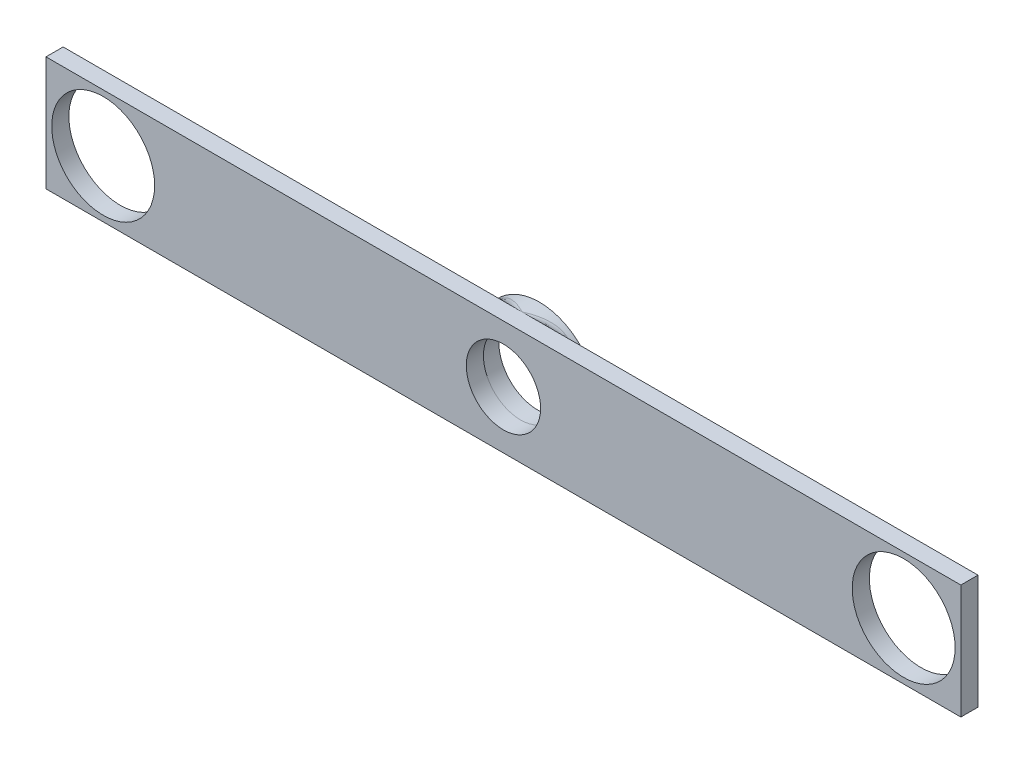
ISO-10303-21;
HEADER;
FILE_DESCRIPTION(('STEP AP214'),'2;1');
FILE_NAME('part.step','',(''),(''),'','','');
FILE_SCHEMA(('AUTOMOTIVE_DESIGN { 1 0 10303 214 1 1 1 1 }'));
ENDSEC;
DATA;
#1=APPLICATION_CONTEXT('core data for automotive mechanical design processes');
#2=APPLICATION_PROTOCOL_DEFINITION('international standard','automotive_design',2000,#1);
#3=PRODUCT_CONTEXT('',#1,'mechanical');
#4=PRODUCT('Part','Part','',(#3));
#5=PRODUCT_RELATED_PRODUCT_CATEGORY('part','',(#4));
#6=PRODUCT_DEFINITION_FORMATION('','',#4);
#7=PRODUCT_DEFINITION_CONTEXT('part definition',#1,'design');
#8=PRODUCT_DEFINITION('design','',#6,#7);
#9=PRODUCT_DEFINITION_SHAPE('','',#8);
#10=(LENGTH_UNIT() NAMED_UNIT(*) SI_UNIT(.MILLI.,.METRE.));
#11=(NAMED_UNIT(*) PLANE_ANGLE_UNIT() SI_UNIT($,.RADIAN.));
#12=(NAMED_UNIT(*) SI_UNIT($,.STERADIAN.) SOLID_ANGLE_UNIT());
#13=UNCERTAINTY_MEASURE_WITH_UNIT(LENGTH_MEASURE(1.E-05),#10,'distance_accuracy_value','');
#14=(GEOMETRIC_REPRESENTATION_CONTEXT(3) GLOBAL_UNCERTAINTY_ASSIGNED_CONTEXT((#13)) GLOBAL_UNIT_ASSIGNED_CONTEXT((#10,
#11,#12)) REPRESENTATION_CONTEXT('',''));
#15=CARTESIAN_POINT('',(0.,0.,0.));
#16=DIRECTION('',(0.,0.,1.));
#17=DIRECTION('',(1.,0.,0.));
#18=AXIS2_PLACEMENT_3D('',#15,#16,#17);
#19=CARTESIAN_POINT('',(0.,0.,34.4107464630014));
#20=DIRECTION('',(0.,0.,1.));
#21=DIRECTION('',(1.,0.,0.));
#22=AXIS2_PLACEMENT_3D('',#19,#20,#21);
#23=PLANE('',#22);
#24=DIRECTION('',(1.,0.,0.));
#25=VECTOR('',#24,1.);
#26=CARTESIAN_POINT('',(-28.6015516653559,2.37763021879761,34.4107464630014));
#27=LINE('',#26,#25);
#28=CARTESIAN_POINT('',(-120.980670706278,2.3776302187976,34.4107464630014));
#29=VERTEX_POINT('',#28);
#30=CARTESIAN_POINT('',(-28.6015516653559,2.37763021879761,34.4107464630014));
#31=VERTEX_POINT('',#30);
#32=EDGE_CURVE('E293',#29,#31,#27,.T.);
#33=ORIENTED_EDGE('',*,*,#32,.F.);
#34=CARTESIAN_POINT('',(-129.831228986063,14.9458338361228,34.4107464630014));
#35=DIRECTION('',(0.,0.,1.));
#36=DIRECTION('',(1.,0.,0.));
#37=AXIS2_PLACEMENT_3D('',#34,#35,#36);
#38=CIRCLE('',#37,15.3717963826748);
#39=CARTESIAN_POINT('',(-121.367357199228,27.7776302187976,34.4107464630014));
#40=VERTEX_POINT('',#39);
#41=EDGE_CURVE('E363',#29,#40,#38,.T.);
#42=ORIENTED_EDGE('',*,*,#41,.T.);
#43=DIRECTION('',(-1.,0.,0.));
#44=VECTOR('',#43,1.);
#45=CARTESIAN_POINT('',(-28.6015516653559,27.7776302187976,34.4107464630014));
#46=LINE('',#45,#44);
#47=CARTESIAN_POINT('',(-28.6015516653559,27.7776302187976,34.4107464630014));
#48=VERTEX_POINT('',#47);
#49=EDGE_CURVE('E124',#48,#40,#46,.T.);
#50=ORIENTED_EDGE('',*,*,#49,.F.);
#51=DIRECTION('',(0.,1.,0.));
#52=VECTOR('',#51,1.);
#53=CARTESIAN_POINT('',(-28.6015516653559,2.37763021879761,34.4107464630014));
#54=LINE('',#53,#52);
#55=EDGE_CURVE('E275',#31,#48,#54,.T.);
#56=ORIENTED_EDGE('',*,*,#55,.F.);
#57=EDGE_LOOP('',(#33,#42,#50,#56));
#58=FACE_BOUND('',#57,.T.);
#59=CARTESIAN_POINT('',(-41.3015516653559,15.0776302187978,34.4107464630014));
#60=DIRECTION('',(0.,0.,1.));
#61=DIRECTION('',(1.,0.,0.));
#62=AXIS2_PLACEMENT_3D('',#59,#60,#61);
#63=CIRCLE('',#62,11.43);
#64=CARTESIAN_POINT('',(-29.8715516653559,15.0776302187978,34.4107464630014));
#65=VERTEX_POINT('',#64);
#66=EDGE_CURVE('E259',#65,#65,#63,.T.);
#67=ORIENTED_EDGE('',*,*,#66,.T.);
#68=EDGE_LOOP('',(#67));
#69=FACE_BOUND('',#68,.T.);
#70=ADVANCED_FACE('F34',(#58,#69),#23,.F.);
#71=CARTESIAN_POINT('',(-130.201551665356,15.0776302187976,34.4107464630014));
#72=DIRECTION('',(0.,0.,1.));
#73=DIRECTION('',(1.,0.,0.));
#74=AXIS2_PLACEMENT_3D('',#71,#72,#73);
#75=CIRCLE('',#74,8.255);
#76=CARTESIAN_POINT('',(-130.201551665356,6.82263021879756,34.4107464630014));
#77=VERTEX_POINT('',#76);
#78=EDGE_CURVE('E269',#77,#77,#75,.T.);
#79=ORIENTED_EDGE('',*,*,#78,.T.);
#80=CARTESIAN_POINT('',(-130.201551665356,15.4509186698988,34.4107464630014));
#81=DIRECTION('',(0.,0.,-1.));
#82=DIRECTION('',(-1.,0.,0.));
#83=AXIS2_PLACEMENT_3D('',#80,#81,#82);
#84=CIRCLE('',#83,8.62828845110121);
#85=EDGE_CURVE('E211',#77,#77,#84,.T.);
#86=ORIENTED_EDGE('',*,*,#85,.T.);
#87=EDGE_LOOP('',(#79,#86));
#88=FACE_BOUND('',#87,.T.);
#89=ADVANCED_FACE('F233',(#88),#23,.F.);
#90=CARTESIAN_POINT('',(0.,0.,38.2207464630014));
#91=DIRECTION('',(0.,0.,1.));
#92=DIRECTION('',(1.,0.,0.));
#93=AXIS2_PLACEMENT_3D('',#90,#91,#92);
#94=PLANE('',#93);
#95=CARTESIAN_POINT('',(-41.3015516653559,15.0776302187978,38.2207464630014));
#96=DIRECTION('',(0.,0.,1.));
#97=DIRECTION('',(1.,0.,0.));
#98=AXIS2_PLACEMENT_3D('',#95,#96,#97);
#99=CIRCLE('',#98,11.43);
#100=CARTESIAN_POINT('',(-29.8715516653559,15.0776302187978,38.2207464630014));
#101=VERTEX_POINT('',#100);
#102=EDGE_CURVE('E266',#101,#101,#99,.T.);
#103=ORIENTED_EDGE('',*,*,#102,.F.);
#104=EDGE_LOOP('',(#103));
#105=FACE_BOUND('',#104,.T.);
#106=DIRECTION('',(0.,1.,0.));
#107=VECTOR('',#106,1.);
#108=CARTESIAN_POINT('',(-28.6015516653559,2.37763021879761,38.2207464630014));
#109=LINE('',#108,#107);
#110=CARTESIAN_POINT('',(-28.6015516653559,2.37763021879761,38.2207464630014));
#111=VERTEX_POINT('',#110);
#112=CARTESIAN_POINT('',(-28.6015516653559,27.7776302187976,38.2207464630014));
#113=VERTEX_POINT('',#112);
#114=EDGE_CURVE('E278',#111,#113,#109,.T.);
#115=ORIENTED_EDGE('',*,*,#114,.T.);
#116=DIRECTION('',(-1.,0.,0.));
#117=VECTOR('',#116,1.);
#118=CARTESIAN_POINT('',(-28.6015516653559,27.7776302187976,38.2207464630014));
#119=LINE('',#118,#117);
#120=CARTESIAN_POINT('',(-231.801551665356,27.7776302187976,38.2207464630014));
#121=VERTEX_POINT('',#120);
#122=EDGE_CURVE('E281',#113,#121,#119,.T.);
#123=ORIENTED_EDGE('',*,*,#122,.T.);
#124=DIRECTION('',(0.,-1.,0.));
#125=VECTOR('',#124,1.);
#126=CARTESIAN_POINT('',(-231.801551665356,2.37763021879758,38.2207464630014));
#127=LINE('',#126,#125);
#128=CARTESIAN_POINT('',(-231.801551665356,2.37763021879758,38.2207464630014));
#129=VERTEX_POINT('',#128);
#130=EDGE_CURVE('E284',#121,#129,#127,.T.);
#131=ORIENTED_EDGE('',*,*,#130,.T.);
#132=DIRECTION('',(1.,0.,0.));
#133=VECTOR('',#132,1.);
#134=CARTESIAN_POINT('',(-28.6015516653559,2.37763021879761,38.2207464630014));
#135=LINE('',#134,#133);
#136=EDGE_CURVE('E286',#129,#111,#135,.T.);
#137=ORIENTED_EDGE('',*,*,#136,.T.);
#138=EDGE_LOOP('',(#115,#123,#131,#137));
#139=FACE_BOUND('',#138,.T.);
#140=CARTESIAN_POINT('',(-130.201551665356,15.0776302187976,38.2207464630014));
#141=DIRECTION('',(0.,0.,1.));
#142=DIRECTION('',(1.,0.,0.));
#143=AXIS2_PLACEMENT_3D('',#140,#141,#142);
#144=CIRCLE('',#143,8.255);
#145=CARTESIAN_POINT('',(-121.946551665356,15.0776302187976,38.2207464630014));
#146=VERTEX_POINT('',#145);
#147=EDGE_CURVE('E272',#146,#146,#144,.T.);
#148=ORIENTED_EDGE('',*,*,#147,.F.);
#149=EDGE_LOOP('',(#148));
#150=FACE_BOUND('',#149,.T.);
#151=CARTESIAN_POINT('',(-219.101551665356,15.0776302187973,38.2207464630014));
#152=DIRECTION('',(0.,0.,1.));
#153=DIRECTION('',(1.,0.,0.));
#154=AXIS2_PLACEMENT_3D('',#151,#152,#153);
#155=CIRCLE('',#154,11.43);
#156=CARTESIAN_POINT('',(-207.671551665356,15.0776302187973,38.2207464630014));
#157=VERTEX_POINT('',#156);
#158=EDGE_CURVE('E255',#157,#157,#155,.T.);
#159=ORIENTED_EDGE('',*,*,#158,.F.);
#160=EDGE_LOOP('',(#159));
#161=FACE_BOUND('',#160,.T.);
#162=ADVANCED_FACE('F238',(#105,#139,#150,#161),#94,.T.);
#163=CARTESIAN_POINT('',(-138.295100772899,27.7776302187976,34.4107464630014));
#164=VERTEX_POINT('',#163);
#165=CARTESIAN_POINT('',(-231.801551665356,27.7776302187976,34.4107464630014));
#166=VERTEX_POINT('',#165);
#167=EDGE_CURVE('E129',#164,#166,#46,.T.);
#168=ORIENTED_EDGE('',*,*,#167,.F.);
#169=CARTESIAN_POINT('',(-129.831228986063,14.9458338361228,34.4107464630014));
#170=DIRECTION('',(0.,0.,1.));
#171=DIRECTION('',(1.,0.,0.));
#172=AXIS2_PLACEMENT_3D('',#169,#170,#171);
#173=CIRCLE('',#172,15.3717963826748);
#174=CARTESIAN_POINT('',(-138.681787265848,2.37763021879759,34.4107464630014));
#175=VERTEX_POINT('',#174);
#176=EDGE_CURVE('E365',#164,#175,#173,.T.);
#177=ORIENTED_EDGE('',*,*,#176,.T.);
#178=CARTESIAN_POINT('',(-231.801551665356,2.37763021879758,34.4107464630014));
#179=VERTEX_POINT('',#178);
#180=EDGE_CURVE('E282',#179,#175,#27,.T.);
#181=ORIENTED_EDGE('',*,*,#180,.F.);
#182=DIRECTION('',(0.,-1.,0.));
#183=VECTOR('',#182,1.);
#184=CARTESIAN_POINT('',(-231.801551665356,2.37763021879758,34.4107464630014));
#185=LINE('',#184,#183);
#186=EDGE_CURVE('E291',#166,#179,#185,.T.);
#187=ORIENTED_EDGE('',*,*,#186,.F.);
#188=EDGE_LOOP('',(#168,#177,#181,#187));
#189=FACE_BOUND('',#188,.T.);
#190=CARTESIAN_POINT('',(-219.101551665356,15.0776302187973,34.4107464630014));
#191=DIRECTION('',(0.,0.,1.));
#192=DIRECTION('',(1.,0.,0.));
#193=AXIS2_PLACEMENT_3D('',#190,#191,#192);
#194=CIRCLE('',#193,11.43);
#195=CARTESIAN_POINT('',(-207.671551665356,15.0776302187973,34.4107464630014));
#196=VERTEX_POINT('',#195);
#197=EDGE_CURVE('E253',#196,#196,#194,.T.);
#198=ORIENTED_EDGE('',*,*,#197,.T.);
#199=EDGE_LOOP('',(#198));
#200=FACE_BOUND('',#199,.T.);
#201=ADVANCED_FACE('F194',(#189,#200),#23,.F.);
#202=CARTESIAN_POINT('',(-28.6015516653559,2.37763021879761,38.2207464630014));
#203=DIRECTION('',(-1.,0.,0.));
#204=DIRECTION('',(0.,0.,1.));
#205=AXIS2_PLACEMENT_3D('',#202,#203,#204);
#206=PLANE('',#205);
#207=ORIENTED_EDGE('',*,*,#55,.T.);
#208=DIRECTION('',(0.,0.,-1.));
#209=VECTOR('',#208,1.);
#210=CARTESIAN_POINT('',(-28.6015516653559,27.7776302187976,38.2207464630014));
#211=LINE('',#210,#209);
#212=EDGE_CURVE('E305',#113,#48,#211,.T.);
#213=ORIENTED_EDGE('',*,*,#212,.F.);
#214=ORIENTED_EDGE('',*,*,#114,.F.);
#215=DIRECTION('',(0.,0.,-1.));
#216=VECTOR('',#215,1.);
#217=CARTESIAN_POINT('',(-28.6015516653559,2.37763021879761,38.2207464630014));
#218=LINE('',#217,#216);
#219=EDGE_CURVE('E288',#111,#31,#218,.T.);
#220=ORIENTED_EDGE('',*,*,#219,.T.);
#221=EDGE_LOOP('',(#207,#213,#214,#220));
#222=FACE_BOUND('',#221,.T.);
#223=ADVANCED_FACE('F231',(#222),#206,.F.);
#224=CARTESIAN_POINT('',(-28.6015516653559,27.7776302187976,38.2207464630014));
#225=DIRECTION('',(0.,-1.,0.));
#226=DIRECTION('',(1.,0.,0.));
#227=AXIS2_PLACEMENT_3D('',#224,#225,#226);
#228=PLANE('',#227);
#229=ORIENTED_EDGE('',*,*,#49,.T.);
#230=CARTESIAN_POINT('',(-129.831228986063,27.7776302187976,34.4107464630014));
#231=VERTEX_POINT('',#230);
#232=EDGE_CURVE('E117',#40,#231,#46,.T.);
#233=ORIENTED_EDGE('',*,*,#232,.T.);
#234=EDGE_CURVE('E121',#231,#164,#46,.T.);
#235=ORIENTED_EDGE('',*,*,#234,.T.);
#236=ORIENTED_EDGE('',*,*,#167,.T.);
#237=DIRECTION('',(0.,0.,-1.));
#238=VECTOR('',#237,1.);
#239=CARTESIAN_POINT('',(-231.801551665356,27.7776302187976,38.2207464630014));
#240=LINE('',#239,#238);
#241=EDGE_CURVE('E302',#121,#166,#240,.T.);
#242=ORIENTED_EDGE('',*,*,#241,.F.);
#243=ORIENTED_EDGE('',*,*,#122,.F.);
#244=ORIENTED_EDGE('',*,*,#212,.T.);
#245=EDGE_LOOP('',(#229,#233,#235,#236,#242,#243,#244));
#246=FACE_BOUND('',#245,.T.);
#247=ADVANCED_FACE('F119',(#246),#228,.F.);
#248=CARTESIAN_POINT('',(-231.801551665356,2.37763021879758,38.2207464630014));
#249=DIRECTION('',(1.,0.,0.));
#250=DIRECTION('',(0.,0.,-1.));
#251=AXIS2_PLACEMENT_3D('',#248,#249,#250);
#252=PLANE('',#251);
#253=ORIENTED_EDGE('',*,*,#186,.T.);
#254=DIRECTION('',(0.,0.,-1.));
#255=VECTOR('',#254,1.);
#256=CARTESIAN_POINT('',(-231.801551665356,2.37763021879758,38.2207464630014));
#257=LINE('',#256,#255);
#258=EDGE_CURVE('E299',#129,#179,#257,.T.);
#259=ORIENTED_EDGE('',*,*,#258,.F.);
#260=ORIENTED_EDGE('',*,*,#130,.F.);
#261=ORIENTED_EDGE('',*,*,#241,.T.);
#262=EDGE_LOOP('',(#253,#259,#260,#261));
#263=FACE_BOUND('',#262,.T.);
#264=ADVANCED_FACE('F224',(#263),#252,.F.);
#265=CARTESIAN_POINT('',(-28.6015516653559,2.37763021879761,38.2207464630014));
#266=DIRECTION('',(0.,1.,0.));
#267=DIRECTION('',(-1.,0.,0.));
#268=AXIS2_PLACEMENT_3D('',#265,#266,#267);
#269=PLANE('',#268);
#270=ORIENTED_EDGE('',*,*,#180,.T.);
#271=CARTESIAN_POINT('',(-138.681787265848,2.37763021879759,34.4107464630014));
#272=CARTESIAN_POINT('',(-138.543996931785,2.37763021879759,34.4107322033788));
#273=CARTESIAN_POINT('',(-138.406239600689,2.37763021879759,34.4070301402904));
#274=CARTESIAN_POINT('',(-138.131129446394,2.37763021879759,34.3928442007863));
#275=CARTESIAN_POINT('',(-137.993776474281,2.37763021879759,34.3823632518594));
#276=CARTESIAN_POINT('',(-137.719896684314,2.37763021879759,34.3552323668637));
#277=CARTESIAN_POINT('',(-137.583368945417,2.37763021879759,34.3385915719233));
#278=CARTESIAN_POINT('',(-137.311120305938,2.37763021879759,34.299629332474));
#279=CARTESIAN_POINT('',(-137.175399501786,2.37763021879759,34.2773072224621));
#280=CARTESIAN_POINT('',(-136.771121039036,2.37763021879759,34.2027459116105));
#281=CARTESIAN_POINT('',(-136.503971891012,2.37763021879759,34.1427558750772));
#282=CARTESIAN_POINT('',(-135.974388871651,2.37763021879759,34.0047134821015));
#283=CARTESIAN_POINT('',(-135.711955804096,2.37763021879759,33.9266580775799));
#284=CARTESIAN_POINT('',(-135.355634276484,2.37763021879759,33.8081867340615));
#285=CARTESIAN_POINT('',(-135.259333977653,2.37763021879759,33.7748925509306));
#286=CARTESIAN_POINT('',(-135.067575064461,2.37763021879759,33.7060245743292));
#287=CARTESIAN_POINT('',(-134.972116274612,2.37763021879759,33.6704512695812));
#288=CARTESIAN_POINT('',(-134.686958412802,2.37763021879759,33.5602738613162));
#289=CARTESIAN_POINT('',(-134.498562741522,2.37763021879759,33.4822404678469));
#290=CARTESIAN_POINT('',(-134.18241437799,2.37763021879759,33.3413143474447));
#291=CARTESIAN_POINT('',(-134.053523897699,2.37763021879759,33.2809624563867));
#292=CARTESIAN_POINT('',(-133.798604681793,2.37763021879759,33.1547457594638));
#293=CARTESIAN_POINT('',(-133.672573105429,2.37763021879759,33.0888867608784));
#294=CARTESIAN_POINT('',(-133.463143940271,2.37763021879759,32.9717405235663));
#295=CARTESIAN_POINT('',(-133.3787106067,2.37763021879759,32.9223161368228));
#296=CARTESIAN_POINT('',(-133.212286643156,2.37763021879759,32.819061588625));
#297=CARTESIAN_POINT('',(-133.130302435162,2.37763021879759,32.7652210310355));
#298=CARTESIAN_POINT('',(-132.968030739854,2.37763021879759,32.6500224068217));
#299=CARTESIAN_POINT('',(-132.887860950114,2.37763021879759,32.5884919235355));
#300=CARTESIAN_POINT('',(-132.773787253067,2.37763021879759,32.4892623219637));
#301=CARTESIAN_POINT('',(-132.736842384652,2.37763021879759,32.4550851608352));
#302=CARTESIAN_POINT('',(-132.665962268227,2.37763021879759,32.383769263175));
#303=CARTESIAN_POINT('',(-132.63202282467,2.37763021879759,32.3466347971851));
#304=CARTESIAN_POINT('',(-132.575094574326,2.37763021879759,32.2764733640809));
#305=CARTESIAN_POINT('',(-132.551277511822,2.37763021879759,32.2441275919245));
#306=CARTESIAN_POINT('',(-132.507908365654,2.37763021879759,32.1766457526617));
#307=CARTESIAN_POINT('',(-132.488352124951,2.37763021879759,32.1415124512666));
#308=CARTESIAN_POINT('',(-132.458669071917,2.37763021879759,32.0756038057517));
#309=CARTESIAN_POINT('',(-132.447443710425,2.37763021879759,32.0453329372127));
#310=CARTESIAN_POINT('',(-132.430200768428,2.37763021879759,31.9833761609145));
#311=CARTESIAN_POINT('',(-132.424166858371,2.37763021879759,31.9516950222787));
#312=CARTESIAN_POINT('',(-132.419524004395,2.37763021879759,31.9034645395491));
#313=CARTESIAN_POINT('',(-132.41872565161,2.37763021879759,31.8871063867348));
#314=CARTESIAN_POINT('',(-132.418748307707,2.37763021879759,31.8707464630013));
#315=B_SPLINE_CURVE_WITH_KNOTS('',3,(#271,#272,#273,#274,#275,#276,#277,#278,#279,#280,#281,
#282,#283,#284,#285,#286,#287,#288,#289,#290,#291,#292,#293,#294,#295,#296,#297,#298,#299,#300,
#301,#302,#303,#304,#305,#306,#307,#308,#309,#310,#311,#312,#313,#314),.UNSPECIFIED.,.F.,.F.,(4,
2,2,2,2,2,2,2,2,2,2,2,2,2,2,2,2,2,2,2,2,4),(0.,0.413273855018525,0.826369355128221,
1.23885426877134,1.65138752270578,2.47201588601664,3.29278281090843,3.59844070808591,
3.90403327960229,4.51548653313657,4.94235050329303,5.36876988602266,5.66217435571689,
5.95629052688636,6.25891525879904,6.40978701529864,6.56044472184935,6.68072946080365,
6.80089631408145,6.89739657163872,6.99359216914598,7.04265718750415),.UNSPECIFIED.);
#316=CARTESIAN_POINT('',(-132.418748307707,2.37763021879759,31.8707464630014));
#317=VERTEX_POINT('',#316);
#318=EDGE_CURVE('E48',#175,#317,#315,.T.);
#319=ORIENTED_EDGE('',*,*,#318,.T.);
#320=DIRECTION('',(0.,0.,1.));
#321=VECTOR('',#320,1.);
#322=CARTESIAN_POINT('',(-132.418748307707,2.37763021879759,34.4107464630014));
#323=LINE('',#322,#321);
#324=CARTESIAN_POINT('',(-132.418748307707,2.37763021879759,34.4107464630014));
#325=VERTEX_POINT('',#324);
#326=EDGE_CURVE('E56',#325,#317,#323,.F.);
#327=ORIENTED_EDGE('',*,*,#326,.F.);
#328=CARTESIAN_POINT('',(-127.243709664419,2.3776302187976,34.4107464630014));
#329=VERTEX_POINT('',#328);
#330=EDGE_CURVE('E296',#325,#329,#27,.T.);
#331=ORIENTED_EDGE('',*,*,#330,.T.);
#332=DIRECTION('',(0.,0.,1.));
#333=VECTOR('',#332,1.);
#334=CARTESIAN_POINT('',(-127.243709664419,2.3776302187976,31.8707464630014));
#335=LINE('',#334,#333);
#336=CARTESIAN_POINT('',(-127.243709664419,2.3776302187976,31.8707464630014));
#337=VERTEX_POINT('',#336);
#338=EDGE_CURVE('E150',#337,#329,#335,.T.);
#339=ORIENTED_EDGE('',*,*,#338,.F.);
#340=CARTESIAN_POINT('',(-127.243709664419,2.3776302187976,31.8707464630014));
#341=CARTESIAN_POINT('',(-127.243820286488,2.3776302187976,31.9033764329404));
#342=CARTESIAN_POINT('',(-127.240595001526,2.3776302187976,31.9358425107738));
#343=CARTESIAN_POINT('',(-127.228562260305,2.3776302187976,31.9992103010193));
#344=CARTESIAN_POINT('',(-127.219844823851,2.3776302187976,32.0301287208004));
#345=CARTESIAN_POINT('',(-127.193755702379,2.3776302187976,32.1014671066879));
#346=CARTESIAN_POINT('',(-127.174368763003,2.3776302187976,32.141129072768));
#347=CARTESIAN_POINT('',(-127.129731489622,2.3776302187976,32.2172390133331));
#348=CARTESIAN_POINT('',(-127.104437784065,2.3776302187976,32.2536603188912));
#349=CARTESIAN_POINT('',(-127.042411960045,2.3776302187976,32.3332801389004));
#350=CARTESIAN_POINT('',(-127.00446189084,2.3776302187976,32.3755119950818));
#351=CARTESIAN_POINT('',(-126.924709976941,2.3776302187976,32.4562171707469));
#352=CARTESIAN_POINT('',(-126.882900381734,2.3776302187976,32.494682593008));
#353=CARTESIAN_POINT('',(-126.796557820772,2.3776302187976,32.5688642599442));
#354=CARTESIAN_POINT('',(-126.752011846849,2.3776302187976,32.6045652001931));
#355=CARTESIAN_POINT('',(-126.661203723997,2.3776302187976,32.6735932544345));
#356=CARTESIAN_POINT('',(-126.614943249148,2.3776302187976,32.7069225958384));
#357=CARTESIAN_POINT('',(-126.479791357578,2.3776302187976,32.8002768601763));
#358=CARTESIAN_POINT('',(-126.389268928905,2.3776302187976,32.8579341327764));
#359=CARTESIAN_POINT('',(-126.205359064055,2.3776302187976,32.9685186518886));
#360=CARTESIAN_POINT('',(-126.11196988754,2.3776302187976,33.0214429456618));
#361=CARTESIAN_POINT('',(-125.92298194442,2.3776302187976,33.1236248720524));
#362=CARTESIAN_POINT('',(-125.827379282929,2.3776302187976,33.1728752763908));
#363=CARTESIAN_POINT('',(-125.634591413671,2.3776302187976,33.2681849965448));
#364=CARTESIAN_POINT('',(-125.53740599132,2.3776302187976,33.3142438751447));
#365=CARTESIAN_POINT('',(-125.243848812909,2.3776302187976,33.4482055825862));
#366=CARTESIAN_POINT('',(-125.045529644113,2.3776302187976,33.5318652282507));
#367=CARTESIAN_POINT('',(-124.645120166976,2.3776302187976,33.6889170845979));
#368=CARTESIAN_POINT('',(-124.443033580135,2.3776302187976,33.7623188761475));
#369=CARTESIAN_POINT('',(-123.975118986061,2.3776302187976,33.9191379777933));
#370=CARTESIAN_POINT('',(-123.708120921602,2.3776302187976,33.9990938651526));
#371=CARTESIAN_POINT('',(-123.169165429789,2.3776302187976,34.140342765381));
#372=CARTESIAN_POINT('',(-122.897208105947,2.3776302187976,34.2016361673089));
#373=CARTESIAN_POINT('',(-122.487957339794,2.3776302187976,34.2771546480891));
#374=CARTESIAN_POINT('',(-122.352138335555,2.3776302187976,34.2995047370875));
#375=CARTESIAN_POINT('',(-122.079692174248,2.3776302187976,34.33851521387));
#376=CARTESIAN_POINT('',(-121.943065119218,2.3776302187976,34.3551763050802));
#377=CARTESIAN_POINT('',(-121.669019210215,2.3776302187976,34.3823359434684));
#378=CARTESIAN_POINT('',(-121.531599587054,2.3776302187976,34.3928268585665));
#379=CARTESIAN_POINT('',(-121.256354688917,2.3776302187976,34.4070264622038));
#380=CARTESIAN_POINT('',(-121.118529262483,2.3776302187976,34.4107321746425));
#381=CARTESIAN_POINT('',(-120.980670706278,2.3776302187976,34.4107464630014));
#382=B_SPLINE_CURVE_WITH_KNOTS('',3,(#340,#341,#342,#343,#344,#345,#346,#347,#348,#349,#350,
#351,#352,#353,#354,#355,#356,#357,#358,#359,#360,#361,#362,#363,#364,#365,#366,#367,#368,#369,
#370,#371,#372,#373,#374,#375,#376,#377,#378,#379,#380,#381),.UNSPECIFIED.,.F.,.F.,(4,2,2,2,2,2,
2,2,2,2,2,2,2,2,2,2,2,2,2,2,4),(0.,0.097468337741965,0.193379249788703,0.325067958143237,
0.457755834565299,0.627682358121884,0.797957868217342,0.969117112870945,1.14011342247966,
1.46185097281831,1.7837878636876,2.10634230680317,2.42894085051296,3.07431915108519,
3.71909057903585,4.55461491250182,5.39012182651218,5.80296036387338,6.21574783659983,
6.62904483079764,7.04252306042468),.UNSPECIFIED.);
#383=EDGE_CURVE('E11',#337,#29,#382,.T.);
#384=ORIENTED_EDGE('',*,*,#383,.T.);
#385=ORIENTED_EDGE('',*,*,#32,.T.);
#386=ORIENTED_EDGE('',*,*,#219,.F.);
#387=ORIENTED_EDGE('',*,*,#136,.F.);
#388=ORIENTED_EDGE('',*,*,#258,.T.);
#389=EDGE_LOOP('',(#270,#319,#327,#331,#339,#384,#385,#386,#387,#388));
#390=FACE_BOUND('',#389,.T.);
#391=ADVANCED_FACE('F220',(#390),#269,.F.);
#392=CARTESIAN_POINT('',(-130.201551665356,15.0776302187976,38.2207464630014));
#393=DIRECTION('',(0.,0.,-1.));
#394=DIRECTION('',(-1.,0.,0.));
#395=AXIS2_PLACEMENT_3D('',#392,#393,#394);
#396=CYLINDRICAL_SURFACE('',#395,8.255);
#397=ORIENTED_EDGE('',*,*,#147,.T.);
#398=EDGE_LOOP('',(#397));
#399=FACE_BOUND('',#398,.T.);
#400=ORIENTED_EDGE('',*,*,#78,.F.);
#401=EDGE_LOOP('',(#400));
#402=FACE_BOUND('',#401,.T.);
#403=ADVANCED_FACE('F223',(#399,#402),#396,.F.);
#404=CARTESIAN_POINT('',(-41.3015516653559,15.0776302187978,38.2207464630014));
#405=DIRECTION('',(0.,0.,-1.));
#406=DIRECTION('',(-1.,0.,0.));
#407=AXIS2_PLACEMENT_3D('',#404,#405,#406);
#408=CYLINDRICAL_SURFACE('',#407,11.43);
#409=ORIENTED_EDGE('',*,*,#102,.T.);
#410=EDGE_LOOP('',(#409));
#411=FACE_BOUND('',#410,.T.);
#412=ORIENTED_EDGE('',*,*,#66,.F.);
#413=EDGE_LOOP('',(#412));
#414=FACE_BOUND('',#413,.T.);
#415=ADVANCED_FACE('F330',(#411,#414),#408,.F.);
#416=CARTESIAN_POINT('',(-219.101551665356,15.0776302187973,38.2207464630014));
#417=DIRECTION('',(0.,0.,-1.));
#418=DIRECTION('',(-1.,0.,0.));
#419=AXIS2_PLACEMENT_3D('',#416,#417,#418);
#420=CYLINDRICAL_SURFACE('',#419,11.43);
#421=ORIENTED_EDGE('',*,*,#158,.T.);
#422=EDGE_LOOP('',(#421));
#423=FACE_BOUND('',#422,.T.);
#424=ORIENTED_EDGE('',*,*,#197,.F.);
#425=EDGE_LOOP('',(#424));
#426=FACE_BOUND('',#425,.T.);
#427=ADVANCED_FACE('F174',(#423,#426),#420,.F.);
#428=CARTESIAN_POINT('',(-129.831228986063,14.9458338361228,30.6007464630014));
#429=DIRECTION('',(0.,0.,-1.));
#430=DIRECTION('',(-1.,0.,0.));
#431=AXIS2_PLACEMENT_3D('',#428,#429,#430);
#432=PLANE('',#431);
#433=CARTESIAN_POINT('',(-129.831228986063,14.9458338361228,30.6007464630014));
#434=DIRECTION('',(0.,0.,-1.));
#435=DIRECTION('',(-1.,0.,0.));
#436=AXIS2_PLACEMENT_3D('',#433,#434,#435);
#437=CIRCLE('',#436,12.8317963826748);
#438=CARTESIAN_POINT('',(-142.663025368738,14.9458338361228,30.6007464630014));
#439=VERTEX_POINT('',#438);
#440=EDGE_CURVE('E256',#439,#439,#437,.T.);
#441=ORIENTED_EDGE('',*,*,#440,.T.);
#442=EDGE_LOOP('',(#441));
#443=FACE_BOUND('',#442,.T.);
#444=CARTESIAN_POINT('',(-130.201551665356,15.4509186698988,30.6007464630014));
#445=DIRECTION('',(0.,0.,-1.));
#446=DIRECTION('',(-1.,0.,0.));
#447=AXIS2_PLACEMENT_3D('',#444,#445,#446);
#448=CIRCLE('',#447,8.62828845110121);
#449=CARTESIAN_POINT('',(-138.829840116457,15.4509186698988,30.6007464630014));
#450=VERTEX_POINT('',#449);
#451=EDGE_CURVE('E309',#450,#450,#448,.T.);
#452=ORIENTED_EDGE('',*,*,#451,.F.);
#453=EDGE_LOOP('',(#452));
#454=FACE_BOUND('',#453,.T.);
#455=ADVANCED_FACE('F323',(#443,#454),#432,.T.);
#456=CARTESIAN_POINT('',(-129.831228986063,14.9458338361228,34.4107464630014));
#457=DIRECTION('',(0.,0.,-1.));
#458=DIRECTION('',(-1.,0.,0.));
#459=AXIS2_PLACEMENT_3D('',#456,#457,#458);
#460=PLANE('',#459);
#461=ORIENTED_EDGE('',*,*,#330,.F.);
#462=CARTESIAN_POINT('',(-129.831228986063,14.9458338361228,34.4107464630014));
#463=DIRECTION('',(0.,0.,-1.));
#464=DIRECTION('',(-1.,0.,0.));
#465=AXIS2_PLACEMENT_3D('',#462,#463,#464);
#466=CIRCLE('',#465,12.8317963826748);
#467=EDGE_CURVE('E262',#329,#325,#466,.T.);
#468=ORIENTED_EDGE('',*,*,#467,.F.);
#469=EDGE_LOOP('',(#461,#468));
#470=FACE_BOUND('',#469,.T.);
#471=ADVANCED_FACE('F171',(#470),#460,.F.);
#472=CARTESIAN_POINT('',(-129.831228986063,14.9458338361228,30.6007464630014));
#473=DIRECTION('',(0.,0.,1.));
#474=DIRECTION('',(1.,0.,0.));
#475=AXIS2_PLACEMENT_3D('',#472,#473,#474);
#476=CYLINDRICAL_SURFACE('',#475,12.8317963826748);
#477=ORIENTED_EDGE('',*,*,#440,.F.);
#478=EDGE_LOOP('',(#477));
#479=FACE_BOUND('',#478,.T.);
#480=ORIENTED_EDGE('',*,*,#467,.T.);
#481=ORIENTED_EDGE('',*,*,#326,.T.);
#482=CARTESIAN_POINT('',(-129.831228986063,14.9458338361228,31.8707464630014));
#483=DIRECTION('',(0.,0.,1.));
#484=DIRECTION('',(1.,0.,0.));
#485=AXIS2_PLACEMENT_3D('',#482,#483,#484);
#486=CIRCLE('',#485,12.8317963826748);
#487=CARTESIAN_POINT('',(-136.896550219445,25.6573339306729,31.8707464630014));
#488=VERTEX_POINT('',#487);
#489=EDGE_CURVE('E139',#317,#488,#486,.F.);
#490=ORIENTED_EDGE('',*,*,#489,.T.);
#491=CARTESIAN_POINT('',(-137.997966697713,24.8432776250786,32.0654119263618));
#492=CARTESIAN_POINT('',(-137.317823212294,25.4044885367188,35.3975040554921));
#493=CARTESIAN_POINT('',(-139.614537999889,27.7776302187976,34.4107464630014));
#494=CARTESIAN_POINT('',(-137.898184710197,24.925642918961,32.0244615973806));
#495=CARTESIAN_POINT('',(-137.31619145335,25.3945941126567,35.2864104581322));
#496=CARTESIAN_POINT('',(-139.495004588663,27.7776302187976,34.4107464630014));
#497=CARTESIAN_POINT('',(-137.795984863958,25.0074046320522,31.990950717667));
#498=CARTESIAN_POINT('',(-137.300666576809,25.3983150843345,35.1763080774204));
#499=CARTESIAN_POINT('',(-139.372574713703,27.7776302187976,34.4107464630014));
#500=CARTESIAN_POINT('',(-137.58783533241,25.1687094031997,31.9370663248458));
#501=CARTESIAN_POINT('',(-137.245839102041,25.4270041777274,34.9671525839827));
#502=CARTESIAN_POINT('',(-139.123222859833,27.7776302187976,34.4107464630014));
#503=CARTESIAN_POINT('',(-137.481894161006,25.2482568442065,31.9166647854153));
#504=CARTESIAN_POINT('',(-137.207387702589,25.4512031036244,34.8676046944639));
#505=CARTESIAN_POINT('',(-138.996311080119,27.7776302187976,34.4107464630014));
#506=CARTESIAN_POINT('',(-137.268020448182,25.4036768801671,31.8872497321726));
#507=CARTESIAN_POINT('',(-137.111890885051,25.513805617218,34.6830620037992));
#508=CARTESIAN_POINT('',(-138.740101967424,27.7776302187976,34.4107464630014));
#509=CARTESIAN_POINT('',(-137.160119692837,25.4795789042362,31.8781209924011));
#510=CARTESIAN_POINT('',(-137.055592589457,25.5516359359234,34.5974194653281));
#511=CARTESIAN_POINT('',(-138.610842712436,27.7776302187976,34.4107464630014));
#512=CARTESIAN_POINT('',(-136.941785215122,25.6281761976292,31.869422747917));
#513=CARTESIAN_POINT('',(-136.928078374175,25.6366149415552,34.4397038180272));
#514=CARTESIAN_POINT('',(-138.34928984528,27.7776302187976,34.4107464630014));
#515=CARTESIAN_POINT('',(-136.831349708883,25.7008690963206,31.8698601953));
#516=CARTESIAN_POINT('',(-136.857196903703,25.6835584079995,34.3671366261216));
#517=CARTESIAN_POINT('',(-138.216994096132,27.7776302187976,34.4107464630014));
#518=CARTESIAN_POINT('',(-136.53447950574,25.889767765837,31.8820849287227));
#519=CARTESIAN_POINT('',(-136.654288892039,25.8149179383443,34.1929812346152));
#520=CARTESIAN_POINT('',(-137.861359687766,27.7776302187976,34.4107464630014));
#521=CARTESIAN_POINT('',(-136.34624542951,26.0028359550347,31.9012115992026));
#522=CARTESIAN_POINT('',(-136.510604900608,25.9052159415421,34.099882899702));
#523=CARTESIAN_POINT('',(-137.635865469674,27.7776302187976,34.4107464630014));
#524=CARTESIAN_POINT('',(-135.96572521555,26.2184045482877,31.9577265436894));
#525=CARTESIAN_POINT('',(-136.200099221983,26.0899735532745,33.9462753085973));
#526=CARTESIAN_POINT('',(-137.180022883489,27.7776302187976,34.4107464630014));
#527=CARTESIAN_POINT('',(-135.773437509349,26.320900767863,31.9951220153128));
#528=CARTESIAN_POINT('',(-136.033543196108,26.1846307689501,33.8842669495467));
#529=CARTESIAN_POINT('',(-136.949672636452,27.7776302187976,34.4107464630014));
#530=CARTESIAN_POINT('',(-135.384462770479,26.5158056294934,32.0848620577732));
#531=CARTESIAN_POINT('',(-135.682977334455,26.3720125341953,33.7869347511059));
#532=CARTESIAN_POINT('',(-136.483701987793,27.7776302187976,34.4107464630014));
#533=CARTESIAN_POINT('',(-135.187754086659,26.6081367216763,32.1373118322316));
#534=CARTESIAN_POINT('',(-135.498695272459,26.4651686456364,33.7507344557767));
#535=CARTESIAN_POINT('',(-136.248055649264,27.7776302187976,34.4107464630014));
#536=CARTESIAN_POINT('',(-134.791983062825,26.7819084269363,32.2541402457593));
#537=CARTESIAN_POINT('',(-135.118377568674,26.6448664242307,33.7005988477998));
#538=CARTESIAN_POINT('',(-135.773943419682,27.7776302187976,34.4107464630014));
#539=CARTESIAN_POINT('',(-134.592919931762,26.8633452597064,32.3185230071825));
#540=CARTESIAN_POINT('',(-134.921992720186,26.7319031027024,33.6859716172936));
#541=CARTESIAN_POINT('',(-135.535476580995,27.7776302187976,34.4107464630014));
#542=CARTESIAN_POINT('',(-134.071684926323,27.0615946861196,32.4988050251184));
#543=CARTESIAN_POINT('',(-134.402780276041,26.9454471354905,33.6713111716585));
#544=CARTESIAN_POINT('',(-134.911065303553,27.7776302187976,34.4107464630014));
#545=CARTESIAN_POINT('',(-133.7480773535,27.1699035971007,32.6222650055567));
#546=CARTESIAN_POINT('',(-134.067955378678,27.0679253551545,33.6839297564815));
#547=CARTESIAN_POINT('',(-134.523400975897,27.7776302187976,34.4107464630014));
#548=CARTESIAN_POINT('',(-133.097755918768,27.3595219489561,32.8863157471679));
#549=CARTESIAN_POINT('',(-133.386398022565,27.2838387706001,33.7412744552699));
#550=CARTESIAN_POINT('',(-133.744351154668,27.7776302187976,34.4107464630014));
#551=CARTESIAN_POINT('',(-132.771040180219,27.4408138522476,33.0269175550235));
#552=CARTESIAN_POINT('',(-133.037294870551,27.378903109663,33.7853676611508));
#553=CARTESIAN_POINT('',(-133.352963412981,27.7776302187976,34.4107464630014));
#554=CARTESIAN_POINT('',(-132.11656439935,27.5768928507671,33.3191054382361));
#555=CARTESIAN_POINT('',(-132.333852281219,27.5381216571089,33.8941231302586));
#556=CARTESIAN_POINT('',(-132.568936910309,27.7776302187976,34.4107464630014));
#557=CARTESIAN_POINT('',(-131.788809241967,27.6317479389243,33.4706621702054));
#558=CARTESIAN_POINT('',(-131.977071746223,27.6035212223766,33.9587362546999));
#559=CARTESIAN_POINT('',(-132.176304001212,27.7776302187976,34.4107464630014));
#560=CARTESIAN_POINT('',(-131.132386922269,27.7157760152116,33.7803347341666));
#561=CARTESIAN_POINT('',(-131.261435519109,27.7033340278577,34.0995888791891));
#562=CARTESIAN_POINT('',(-131.389945650557,27.7776302187976,34.4107464630014));
#563=CARTESIAN_POINT('',(-130.803720331602,27.7449625224315,33.9384470674584));
#564=CARTESIAN_POINT('',(-130.900075082419,27.7384755764574,34.1761854417423));
#565=CARTESIAN_POINT('',(-130.9962208938,27.7776302187976,34.4107464630014));
#566=CARTESIAN_POINT('',(-130.266763462692,27.7719288181576,34.1986747196717));
#567=CARTESIAN_POINT('',(-130.31018917981,27.7707867053758,34.3046580824113));
#568=CARTESIAN_POINT('',(-130.352975676293,27.7776302187976,34.4107464630014));
#569=CARTESIAN_POINT('',(-130.058575713676,27.7773048327195,34.3000385600479));
#570=CARTESIAN_POINT('',(-130.08108639175,27.7772401468474,34.3553909482958));
#571=CARTESIAN_POINT('',(-130.10357804,27.7776302187976,34.4107464630014));
#572=CARTESIAN_POINT('',(-129.844012673759,27.7776254420279,34.4045213406037));
#573=CARTESIAN_POINT('',(-129.845277921879,27.7776245044993,34.407633900193));
#574=CARTESIAN_POINT('',(-129.846543150847,27.7776302187976,34.4107464630014));
#575=CARTESIAN_POINT('',(-129.837620820865,27.7776302178474,34.4076339059704));
#576=CARTESIAN_POINT('',(-129.838253439598,27.7776302264231,34.4091901849288));
#577=CARTESIAN_POINT('',(-129.838886057618,27.7776302187976,34.4107464630014));
#578=CARTESIAN_POINT('',(-129.831228986063,27.7776302187976,34.4107464630014));
#579=CARTESIAN_POINT('',(-129.831228986063,27.7776302187976,34.4107464630014));
#580=CARTESIAN_POINT('',(-129.831228986063,27.7776302187976,34.4107464630014));
#581=(BOUNDED_SURFACE() B_SPLINE_SURFACE(3,2,((#491,#492,#493),(#494,#495,#496),(#497,#498,
#499),(#500,#501,#502),(#503,#504,#505),(#506,#507,#508),(#509,#510,#511),(#512,#513,#514),
(#515,#516,#517),(#518,#519,#520),(#521,#522,#523),(#524,#525,#526),(#527,#528,#529),(#530,#531,
#532),(#533,#534,#535),(#536,#537,#538),(#539,#540,#541),(#542,#543,#544),(#545,#546,#547),
(#548,#549,#550),(#551,#552,#553),(#554,#555,#556),(#557,#558,#559),(#560,#561,#562),(#563,#564,
#565),(#566,#567,#568),(#569,#570,#571),(#572,#573,#574),(#575,#576,#577),(#578,#579,#580)),
.UNSPECIFIED.,.F.,.F.,.F.) B_SPLINE_SURFACE_WITH_KNOTS((4,2,2,2,2,2,2,2,2,2,2,2,2,2,4),(3,3),
(0.,0.480475931142852,0.959921209763986,1.43442410617358,1.90927185251656,2.69924038052922,
3.4895203948541,4.28546348404987,5.08168205294101,6.36084703588476,7.64084075026591,
8.91752464003981,10.1935357244804,11.0011149975801,11.0259116132747),(0.,1.),
.UNSPECIFIED.) GEOMETRIC_REPRESENTATION_ITEM() RATIONAL_B_SPLINE_SURFACE(((1.,0.593237916902666,
1.),(1.,0.604826063703456,1.),(1.,0.61630525691148,1.),(1.,0.638913162219788,1.),(1.,
0.650042573305835,1.),(1.,0.671756482141769,1.),(1.,0.682345414475521,1.),(1.,0.703051668226804,
1.),(1.,0.713168641303308,1.),(1.,0.739432811101483,1.),(1.,0.75512631969924,1.),(1.,
0.785010796347588,1.),(1.,0.79920116950323,1.),(1.,0.826160657220657,1.),(1.,0.838918858493038,
1.),(1.,0.862913387143888,1.),(1.,0.874149186266264,1.),(1.,0.90148674341587,1.),(1.,
0.916406265255505,1.),(1.,0.942512178800705,1.),(1.,0.95369614566446,1.),(1.,0.972411447418386,
1.),(1.,0.979952152551619,1.),(1.,0.991501285478234,1.),(1.,0.995511572667966,1.),(1.,
0.999216688777481,1.),(1.,0.999955295210559,1.),(1.,0.99999934370611,1.),(1.,0.999999999859389,
1.),(1.,1.,1.))) REPRESENTATION_ITEM('') SURFACE());
#582=CARTESIAN_POINT('',(-137.997966697713,24.8432776250786,32.0654119263618));
#583=CARTESIAN_POINT('',(-137.898184710197,24.925642918961,32.0244615973806));
#584=CARTESIAN_POINT('',(-137.795984863958,25.0074046320522,31.990950717667));
#585=CARTESIAN_POINT('',(-137.58783533241,25.1687094031997,31.9370663248458));
#586=CARTESIAN_POINT('',(-137.481894161006,25.2482568442065,31.9166647854153));
#587=CARTESIAN_POINT('',(-137.268020448182,25.4036768801671,31.8872497321726));
#588=CARTESIAN_POINT('',(-137.160119692837,25.4795789042362,31.8781209924011));
#589=CARTESIAN_POINT('',(-136.941785215122,25.6281761976292,31.869422747917));
#590=CARTESIAN_POINT('',(-136.831349708883,25.7008690963206,31.8698601953));
#591=CARTESIAN_POINT('',(-136.53447950574,25.889767765837,31.8820849287227));
#592=CARTESIAN_POINT('',(-136.34624542951,26.0028359550347,31.9012115992026));
#593=CARTESIAN_POINT('',(-135.96572521555,26.2184045482877,31.9577265436894));
#594=CARTESIAN_POINT('',(-135.773437509349,26.320900767863,31.9951220153128));
#595=CARTESIAN_POINT('',(-135.384462770479,26.5158056294934,32.0848620577732));
#596=CARTESIAN_POINT('',(-135.187754086659,26.6081367216763,32.1373118322316));
#597=CARTESIAN_POINT('',(-134.791983062825,26.7819084269363,32.2541402457593));
#598=CARTESIAN_POINT('',(-134.592919931762,26.8633452597064,32.3185230071825));
#599=CARTESIAN_POINT('',(-134.071684926323,27.0615946861196,32.4988050251184));
#600=CARTESIAN_POINT('',(-133.7480773535,27.1699035971007,32.6222650055567));
#601=CARTESIAN_POINT('',(-133.097755918768,27.3595219489561,32.8863157471679));
#602=CARTESIAN_POINT('',(-132.771040180219,27.4408138522476,33.0269175550235));
#603=CARTESIAN_POINT('',(-132.11656439935,27.5768928507671,33.3191054382361));
#604=CARTESIAN_POINT('',(-131.788809241967,27.6317479389243,33.4706621702054));
#605=CARTESIAN_POINT('',(-131.132386922269,27.7157760152116,33.7803347341666));
#606=CARTESIAN_POINT('',(-130.803720331602,27.7449625224315,33.9384470674584));
#607=CARTESIAN_POINT('',(-130.266763462692,27.7719288181576,34.1986747196717));
#608=CARTESIAN_POINT('',(-130.058575713676,27.7773048327196,34.3000385600479));
#609=CARTESIAN_POINT('',(-129.844012673759,27.7776254420279,34.4045213406037));
#610=CARTESIAN_POINT('',(-129.837620820865,27.7776302178474,34.4076339059704));
#611=CARTESIAN_POINT('',(-129.831228986063,27.7776302187976,34.4107464630014));
#612=B_SPLINE_CURVE_WITH_KNOTS('',3,(#582,#583,#584,#585,#586,#587,#588,#589,#590,#591,#592,
#593,#594,#595,#596,#597,#598,#599,#600,#601,#602,#603,#604,#605,#606,#607,#608,#609,#610,#611),
.UNSPECIFIED.,.F.,.F.,(4,2,2,2,2,2,2,2,2,2,2,2,2,2,4),(0.,0.480475931142852,0.959921209763986,
1.43442410617358,1.90927185251656,2.69924038052922,3.4895203948541,4.28546348404987,
5.08168205294101,6.36084703588476,7.64084075026591,8.91752464003981,10.1935357244804,
11.0011149975801,11.0259116132747),.UNSPECIFIED.);
#613=EDGE_CURVE('E134',#488,#231,#612,.T.);
#614=ORIENTED_EDGE('',*,*,#613,.T.);
#615=CARTESIAN_POINT('',(-120.047919972237,27.7776302187976,34.4107464630014));
#616=CARTESIAN_POINT('',(-122.344634759833,25.4044885367188,35.3975040554929));
#617=CARTESIAN_POINT('',(-121.664491274413,24.843277625078,32.0654119263621));
#618=CARTESIAN_POINT('',(-120.167453383463,27.7776302187976,34.4107464630014));
#619=CARTESIAN_POINT('',(-122.346266518777,25.3945941126567,35.286410458133));
#620=CARTESIAN_POINT('',(-121.764273261929,24.9256429189604,32.0244615973809));
#621=CARTESIAN_POINT('',(-120.289883258422,27.7776302187976,34.4107464630014));
#622=CARTESIAN_POINT('',(-122.361791395317,25.3983150843345,35.1763080774212));
#623=CARTESIAN_POINT('',(-121.866473108167,25.0074046320516,31.9909507176672));
#624=CARTESIAN_POINT('',(-120.539235112292,27.7776302187976,34.4107464630014));
#625=CARTESIAN_POINT('',(-122.416618870085,25.4270041777272,34.9671525839835));
#626=CARTESIAN_POINT('',(-122.074622639715,25.168709403199,31.937066324846));
#627=CARTESIAN_POINT('',(-120.666146892007,27.7776302187976,34.4107464630014));
#628=CARTESIAN_POINT('',(-122.455070269537,25.4512031036242,34.8676046944647));
#629=CARTESIAN_POINT('',(-122.18056381112,25.2482568442058,31.9166647854155));
#630=CARTESIAN_POINT('',(-120.922356004701,27.7776302187976,34.4107464630014));
#631=CARTESIAN_POINT('',(-122.550567087075,25.5138056172176,34.6830620038001));
#632=CARTESIAN_POINT('',(-122.394437523943,25.4036768801664,31.8872497321727));
#633=CARTESIAN_POINT('',(-121.051615259689,27.7776302187976,34.4107464630014));
#634=CARTESIAN_POINT('',(-122.606865382669,25.551635935923,34.5974194653289));
#635=CARTESIAN_POINT('',(-122.502338279289,25.4795789042355,31.8781209924012));
#636=CARTESIAN_POINT('',(-121.313168126845,27.7776302187976,34.4107464630014));
#637=CARTESIAN_POINT('',(-122.73437959795,25.6366149415547,34.4397038180281));
#638=CARTESIAN_POINT('',(-122.720672757003,25.6281761976284,31.8694227479171));
#639=CARTESIAN_POINT('',(-121.445463875993,27.7776302187976,34.4107464630014));
#640=CARTESIAN_POINT('',(-122.805261068423,25.6835584079989,34.3671366261224));
#641=CARTESIAN_POINT('',(-122.831108263242,25.7008690963198,31.8698601953));
#642=CARTESIAN_POINT('',(-121.801098284359,27.7776302187976,34.4107464630014));
#643=CARTESIAN_POINT('',(-123.008169080087,25.8149179383437,34.1929812346159));
#644=CARTESIAN_POINT('',(-123.127978466385,25.8897677658361,31.8820849287226));
#645=CARTESIAN_POINT('',(-122.026592502451,27.7776302187976,34.4107464630014));
#646=CARTESIAN_POINT('',(-123.151853071517,25.9052159415414,34.0998828997027));
#647=CARTESIAN_POINT('',(-123.316212542615,26.0028359550338,31.9012115992024));
#648=CARTESIAN_POINT('',(-122.482435088636,27.7776302187976,34.4107464630014));
#649=CARTESIAN_POINT('',(-123.462358750142,26.0899735532737,33.9462753085978));
#650=CARTESIAN_POINT('',(-123.696732756575,26.2184045482868,31.9577265436891));
#651=CARTESIAN_POINT('',(-122.712785335672,27.7776302187976,34.4107464630014));
#652=CARTESIAN_POINT('',(-123.628914776017,26.1846307689493,33.8842669495472));
#653=CARTESIAN_POINT('',(-123.889020462776,26.3209007678621,31.9951220153125));
#654=CARTESIAN_POINT('',(-123.178755984331,27.7776302187976,34.4107464630014));
#655=CARTESIAN_POINT('',(-123.97948063767,26.3720125341944,33.7869347511063));
#656=CARTESIAN_POINT('',(-124.277995201645,26.5158056294925,32.0848620577727));
#657=CARTESIAN_POINT('',(-123.41440232286,27.7776302187976,34.4107464630014));
#658=CARTESIAN_POINT('',(-124.163762699666,26.4651686456355,33.750734455777));
#659=CARTESIAN_POINT('',(-124.474703885465,26.6081367216754,32.1373118322311));
#660=CARTESIAN_POINT('',(-123.888514552442,27.7776302187976,34.4107464630014));
#661=CARTESIAN_POINT('',(-124.54408040345,26.6448664242297,33.7005988478));
#662=CARTESIAN_POINT('',(-124.8704749093,26.7819084269354,32.2541402457586));
#663=CARTESIAN_POINT('',(-124.126981391129,27.7776302187976,34.4107464630014));
#664=CARTESIAN_POINT('',(-124.740465251939,26.7319031027014,33.6859716172937));
#665=CARTESIAN_POINT('',(-125.069538040363,26.8633452597055,32.3185230071818));
#666=CARTESIAN_POINT('',(-124.751392668571,27.7776302187976,34.4107464630014));
#667=CARTESIAN_POINT('',(-125.259677696083,26.9454471354895,33.6713111716584));
#668=CARTESIAN_POINT('',(-125.590773045801,27.0615946861187,32.4988050251175));
#669=CARTESIAN_POINT('',(-125.139056996226,27.7776302187976,34.4107464630014));
#670=CARTESIAN_POINT('',(-125.594502593445,27.0679253551536,33.6839297564814));
#671=CARTESIAN_POINT('',(-125.914380618624,27.1699035970999,32.6222650055557));
#672=CARTESIAN_POINT('',(-125.918106817455,27.7776302187976,34.4107464630014));
#673=CARTESIAN_POINT('',(-126.276059949558,27.2838387705993,33.7412744552695));
#674=CARTESIAN_POINT('',(-126.564702053356,27.3595219489554,32.8863157471667));
#675=CARTESIAN_POINT('',(-126.309494559142,27.7776302187976,34.4107464630014));
#676=CARTESIAN_POINT('',(-126.625163101572,27.3789031096623,33.7853676611504));
#677=CARTESIAN_POINT('',(-126.891417791905,27.4408138522469,33.0269175550222));
#678=CARTESIAN_POINT('',(-127.093521061814,27.7776302187976,34.4107464630014));
#679=CARTESIAN_POINT('',(-127.328605690904,27.5381216571083,33.8941231302581));
#680=CARTESIAN_POINT('',(-127.545893572773,27.5768928507665,33.3191054382347));
#681=CARTESIAN_POINT('',(-127.48615397091,27.7776302187976,34.4107464630014));
#682=CARTESIAN_POINT('',(-127.6853862259,27.603521222376,33.9587362546992));
#683=CARTESIAN_POINT('',(-127.873648730157,27.6317479389239,33.4706621702039));
#684=CARTESIAN_POINT('',(-128.272512321566,27.7776302187976,34.4107464630014));
#685=CARTESIAN_POINT('',(-128.401022453014,27.7033340278573,34.0995888791883));
#686=CARTESIAN_POINT('',(-128.530071049854,27.7157760152113,33.7803347341651));
#687=CARTESIAN_POINT('',(-128.666237078323,27.7776302187976,34.4107464630014));
#688=CARTESIAN_POINT('',(-128.762382889704,27.7384755764571,34.1761854417415));
#689=CARTESIAN_POINT('',(-128.858737640521,27.7449625224313,33.9384470674568));
#690=CARTESIAN_POINT('',(-129.30948229583,27.7776302187976,34.4107464630014));
#691=CARTESIAN_POINT('',(-129.352268792314,27.7707867053758,34.3046580824107));
#692=CARTESIAN_POINT('',(-129.395694509432,27.7719288181575,34.1986747196705));
#693=CARTESIAN_POINT('',(-129.558879932125,27.7776302187976,34.4107464630014));
#694=CARTESIAN_POINT('',(-129.581371580375,27.7772401468475,34.3553909482955));
#695=CARTESIAN_POINT('',(-129.603882258449,27.7773048327195,34.3000385600473));
#696=CARTESIAN_POINT('',(-129.815914821279,27.7776302187976,34.4107464630014));
#697=CARTESIAN_POINT('',(-129.817180050248,27.7776245044993,34.407633900193));
#698=CARTESIAN_POINT('',(-129.818445298368,27.7776254420279,34.4045213406037));
#699=CARTESIAN_POINT('',(-129.823571914508,27.7776302187976,34.4107464630014));
#700=CARTESIAN_POINT('',(-129.824204532529,27.7776302264231,34.4091901849288));
#701=CARTESIAN_POINT('',(-129.824837151262,27.7776302178474,34.4076339059703));
#702=CARTESIAN_POINT('',(-129.831228986063,27.7776302187976,34.4107464630014));
#703=CARTESIAN_POINT('',(-129.831228986063,27.7776302187976,34.4107464630014));
#704=CARTESIAN_POINT('',(-129.831228986063,27.7776302187976,34.4107464630014));
#705=(BOUNDED_SURFACE() B_SPLINE_SURFACE(3,2,((#615,#616,#617),(#618,#619,#620),(#621,#622,
#623),(#624,#625,#626),(#627,#628,#629),(#630,#631,#632),(#633,#634,#635),(#636,#637,#638),
(#639,#640,#641),(#642,#643,#644),(#645,#646,#647),(#648,#649,#650),(#651,#652,#653),(#654,#655,
#656),(#657,#658,#659),(#660,#661,#662),(#663,#664,#665),(#666,#667,#668),(#669,#670,#671),
(#672,#673,#674),(#675,#676,#677),(#678,#679,#680),(#681,#682,#683),(#684,#685,#686),(#687,#688,
#689),(#690,#691,#692),(#693,#694,#695),(#696,#697,#698),(#699,#700,#701),(#702,#703,#704)),
.UNSPECIFIED.,.F.,.F.,.F.) B_SPLINE_SURFACE_WITH_KNOTS((4,2,2,2,2,2,2,2,2,2,2,2,2,2,4),(3,3),
(0.,0.480475931142699,0.959921209763633,1.43442410617302,1.90927185251584,2.69924038052819,
3.48952039485278,4.28546348404815,5.081682052939,6.36084703588239,7.64084075026317,
8.91752464003672,10.1935357244769,11.0011149975812,11.0259116132758),(0.,1.),
.UNSPECIFIED.) GEOMETRIC_REPRESENTATION_ITEM() RATIONAL_B_SPLINE_SURFACE(((1.,0.593237916902585,
1.),(1.,0.604826063703373,1.),(1.,0.616305256911395,1.),(1.,0.638913162219697,1.),(1.,
0.65004257330574,1.),(1.,0.671756482141666,1.),(1.,0.682345414475415,1.),(1.,0.703051668226693,
1.),(1.,0.713168641303196,1.),(1.,0.739432811101367,1.),(1.,0.755126319699122,1.),(1.,
0.785010796347466,1.),(1.,0.799201169503107,1.),(1.,0.826160657220531,1.),(1.,0.838918858492912,
1.),(1.,0.862913387143763,1.),(1.,0.87414918626614,1.),(1.,0.901486743415753,1.),(1.,
0.916406265255392,1.),(1.,0.942512178800605,1.),(1.,0.953696145664367,1.),(1.,0.97241144741831,
1.),(1.,0.979952152551552,1.),(1.,0.991501285478187,1.),(1.,0.99551157266793,1.),(1.,
0.999216688777472,1.),(1.,0.999955295210559,1.),(1.,0.99999934370611,1.),(1.,0.999999999859389,
1.),(1.,1.,1.))) REPRESENTATION_ITEM('') SURFACE());
#706=CARTESIAN_POINT('',(-121.664491274413,24.843277625078,32.0654119263621));
#707=CARTESIAN_POINT('',(-121.764273261929,24.9256429189604,32.0244615973809));
#708=CARTESIAN_POINT('',(-121.866473108167,25.0074046320516,31.9909507176672));
#709=CARTESIAN_POINT('',(-122.074622639715,25.168709403199,31.937066324846));
#710=CARTESIAN_POINT('',(-122.18056381112,25.2482568442058,31.9166647854155));
#711=CARTESIAN_POINT('',(-122.394437523943,25.4036768801664,31.8872497321727));
#712=CARTESIAN_POINT('',(-122.502338279289,25.4795789042355,31.8781209924012));
#713=CARTESIAN_POINT('',(-122.720672757003,25.6281761976284,31.8694227479171));
#714=CARTESIAN_POINT('',(-122.831108263242,25.7008690963198,31.8698601953));
#715=CARTESIAN_POINT('',(-123.127978466385,25.8897677658361,31.8820849287226));
#716=CARTESIAN_POINT('',(-123.316212542615,26.0028359550338,31.9012115992024));
#717=CARTESIAN_POINT('',(-123.696732756575,26.2184045482868,31.9577265436891));
#718=CARTESIAN_POINT('',(-123.889020462776,26.3209007678621,31.9951220153125));
#719=CARTESIAN_POINT('',(-124.277995201645,26.5158056294925,32.0848620577727));
#720=CARTESIAN_POINT('',(-124.474703885465,26.6081367216754,32.1373118322311));
#721=CARTESIAN_POINT('',(-124.8704749093,26.7819084269354,32.2541402457586));
#722=CARTESIAN_POINT('',(-125.069538040363,26.8633452597055,32.3185230071818));
#723=CARTESIAN_POINT('',(-125.590773045801,27.0615946861187,32.4988050251175));
#724=CARTESIAN_POINT('',(-125.914380618624,27.1699035970999,32.6222650055557));
#725=CARTESIAN_POINT('',(-126.564702053356,27.3595219489554,32.8863157471667));
#726=CARTESIAN_POINT('',(-126.891417791905,27.4408138522469,33.0269175550222));
#727=CARTESIAN_POINT('',(-127.545893572773,27.5768928507665,33.3191054382347));
#728=CARTESIAN_POINT('',(-127.873648730157,27.6317479389239,33.4706621702039));
#729=CARTESIAN_POINT('',(-128.530071049854,27.7157760152113,33.7803347341651));
#730=CARTESIAN_POINT('',(-128.858737640521,27.7449625224313,33.9384470674568));
#731=CARTESIAN_POINT('',(-129.395694509432,27.7719288181575,34.1986747196705));
#732=CARTESIAN_POINT('',(-129.603882258449,27.7773048327196,34.3000385600473));
#733=CARTESIAN_POINT('',(-129.818445298368,27.7776254420279,34.4045213406037));
#734=CARTESIAN_POINT('',(-129.824837151262,27.7776302178474,34.4076339059704));
#735=CARTESIAN_POINT('',(-129.831228986063,27.7776302187976,34.4107464630014));
#736=B_SPLINE_CURVE_WITH_KNOTS('',3,(#706,#707,#708,#709,#710,#711,#712,#713,#714,#715,#716,
#717,#718,#719,#720,#721,#722,#723,#724,#725,#726,#727,#728,#729,#730,#731,#732,#733,#734,#735),
.UNSPECIFIED.,.F.,.F.,(4,2,2,2,2,2,2,2,2,2,2,2,2,2,4),(0.,0.480475931142699,0.959921209763633,
1.43442410617302,1.90927185251584,2.69924038052819,3.48952039485278,4.28546348404815,
5.081682052939,6.36084703588239,7.64084075026317,8.91752464003672,10.1935357244769,
11.0011149975812,11.0259116132758),.UNSPECIFIED.);
#737=CARTESIAN_POINT('',(-122.765907752681,25.6573339306729,31.8707464630014));
#738=VERTEX_POINT('',#737);
#739=EDGE_CURVE('E137',#231,#738,#736,.F.);
#740=ORIENTED_EDGE('',*,*,#739,.T.);
#741=CARTESIAN_POINT('',(-129.831228986063,14.9458338361228,31.8707464630014));
#742=DIRECTION('',(0.,0.,1.));
#743=DIRECTION('',(1.,0.,0.));
#744=AXIS2_PLACEMENT_3D('',#741,#742,#743);
#745=CIRCLE('',#744,12.8317963826748);
#746=EDGE_CURVE('E148',#738,#337,#745,.F.);
#747=ORIENTED_EDGE('',*,*,#746,.T.);
#748=ORIENTED_EDGE('',*,*,#338,.T.);
#749=EDGE_LOOP('',(#480,#481,#490,#614,#740,#747,#748));
#750=FACE_BOUND('',#749,.T.);
#751=ADVANCED_FACE('F135',(#479,#750),#476,.T.);
#752=CARTESIAN_POINT('',(-130.201551665356,15.4509186698988,30.6007464630014));
#753=DIRECTION('',(0.,0.,1.));
#754=DIRECTION('',(1.,0.,0.));
#755=AXIS2_PLACEMENT_3D('',#752,#753,#754);
#756=CYLINDRICAL_SURFACE('',#755,8.62828845110121);
#757=ORIENTED_EDGE('',*,*,#451,.T.);
#758=EDGE_LOOP('',(#757));
#759=FACE_BOUND('',#758,.T.);
#760=ORIENTED_EDGE('',*,*,#85,.F.);
#761=EDGE_LOOP('',(#760));
#762=FACE_BOUND('',#761,.T.);
#763=ADVANCED_FACE('F170',(#759,#762),#756,.F.);
#764=ORIENTED_EDGE('',*,*,#234,.F.);
#765=ORIENTED_EDGE('',*,*,#613,.F.);
#766=CARTESIAN_POINT('',(-138.295100772899,27.7776302187976,31.8707464630014));
#767=DIRECTION('',(-0.834762318159326,-0.550610454115491,0.));
#768=DIRECTION('',(0.550610454115491,-0.834762318159326,0.));
#769=AXIS2_PLACEMENT_3D('',#766,#767,#768);
#770=CIRCLE('',#769,2.54);
#771=EDGE_CURVE('E144',#164,#488,#770,.F.);
#772=ORIENTED_EDGE('',*,*,#771,.F.);
#773=EDGE_LOOP('',(#764,#765,#772));
#774=FACE_BOUND('',#773,.T.);
#775=ADVANCED_FACE('F143',(#774),#581,.F.);
#776=CARTESIAN_POINT('',(-129.831228986063,14.9458338361228,31.8707464630014));
#777=DIRECTION('',(0.,0.,1.));
#778=DIRECTION('',(1.,0.,0.));
#779=AXIS2_PLACEMENT_3D('',#776,#777,#778);
#780=TOROIDAL_SURFACE('',#779,15.3717963826748,2.54);
#781=ORIENTED_EDGE('',*,*,#318,.F.);
#782=ORIENTED_EDGE('',*,*,#176,.F.);
#783=ORIENTED_EDGE('',*,*,#771,.T.);
#784=ORIENTED_EDGE('',*,*,#489,.F.);
#785=EDGE_LOOP('',(#781,#782,#783,#784));
#786=FACE_BOUND('',#785,.T.);
#787=ADVANCED_FACE('F322',(#786),#780,.F.);
#788=CARTESIAN_POINT('',(-129.831228986063,14.9458338361228,31.8707464630014));
#789=DIRECTION('',(0.,0.,1.));
#790=DIRECTION('',(1.,0.,0.));
#791=AXIS2_PLACEMENT_3D('',#788,#789,#790);
#792=TOROIDAL_SURFACE('',#791,15.3717963826748,2.54);
#793=ORIENTED_EDGE('',*,*,#383,.F.);
#794=ORIENTED_EDGE('',*,*,#746,.F.);
#795=CARTESIAN_POINT('',(-121.367357199228,27.7776302187976,31.8707464630014));
#796=DIRECTION('',(0.834762318159329,-0.550610454115487,0.));
#797=DIRECTION('',(0.550610454115487,0.834762318159329,0.));
#798=AXIS2_PLACEMENT_3D('',#795,#796,#797);
#799=CIRCLE('',#798,2.54);
#800=EDGE_CURVE('E146',#40,#738,#799,.T.);
#801=ORIENTED_EDGE('',*,*,#800,.F.);
#802=ORIENTED_EDGE('',*,*,#41,.F.);
#803=EDGE_LOOP('',(#793,#794,#801,#802));
#804=FACE_BOUND('',#803,.T.);
#805=ADVANCED_FACE('F36',(#804),#792,.F.);
#806=ORIENTED_EDGE('',*,*,#739,.F.);
#807=ORIENTED_EDGE('',*,*,#232,.F.);
#808=ORIENTED_EDGE('',*,*,#800,.T.);
#809=EDGE_LOOP('',(#806,#807,#808));
#810=FACE_BOUND('',#809,.T.);
#811=ADVANCED_FACE('F145',(#810),#705,.F.);
#812=CLOSED_SHELL('',(#70,#89,#162,#201,#223,#247,#264,#391,#403,#415,#427,#455,#471,#751,#763,
#775,#787,#805,#811));
#813=MANIFOLD_SOLID_BREP('B2',#812);
#814=ADVANCED_BREP_SHAPE_REPRESENTATION('',(#18,#813),#14);
#815=SHAPE_DEFINITION_REPRESENTATION(#9,#814);
ENDSEC;
END-ISO-10303-21;
